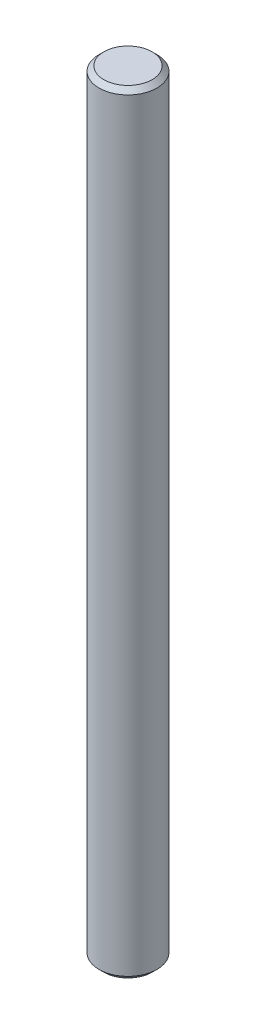
ISO-10303-21;
HEADER;
FILE_DESCRIPTION(('STEP AP214'),'2;1');
FILE_NAME('part.step','',(''),(''),'','','');
FILE_SCHEMA(('AUTOMOTIVE_DESIGN { 1 0 10303 214 1 1 1 1 }'));
ENDSEC;
DATA;
#1=APPLICATION_CONTEXT('core data for automotive mechanical design processes');
#2=APPLICATION_PROTOCOL_DEFINITION('international standard','automotive_design',2000,#1);
#3=PRODUCT_CONTEXT('',#1,'mechanical');
#4=PRODUCT('Part','Part','',(#3));
#5=PRODUCT_RELATED_PRODUCT_CATEGORY('part','',(#4));
#6=PRODUCT_DEFINITION_FORMATION('','',#4);
#7=PRODUCT_DEFINITION_CONTEXT('part definition',#1,'design');
#8=PRODUCT_DEFINITION('design','',#6,#7);
#9=PRODUCT_DEFINITION_SHAPE('','',#8);
#10=(LENGTH_UNIT() NAMED_UNIT(*) SI_UNIT(.MILLI.,.METRE.));
#11=(NAMED_UNIT(*) PLANE_ANGLE_UNIT() SI_UNIT($,.RADIAN.));
#12=(NAMED_UNIT(*) SI_UNIT($,.STERADIAN.) SOLID_ANGLE_UNIT());
#13=UNCERTAINTY_MEASURE_WITH_UNIT(LENGTH_MEASURE(1.E-05),#10,'distance_accuracy_value','');
#14=(GEOMETRIC_REPRESENTATION_CONTEXT(3) GLOBAL_UNCERTAINTY_ASSIGNED_CONTEXT((#13)) GLOBAL_UNIT_ASSIGNED_CONTEXT((#10,
#11,#12)) REPRESENTATION_CONTEXT('',''));
#15=CARTESIAN_POINT('',(0.,0.,0.));
#16=DIRECTION('',(0.,0.,1.));
#17=DIRECTION('',(1.,0.,0.));
#18=AXIS2_PLACEMENT_3D('',#15,#16,#17);
#19=CARTESIAN_POINT('',(0.,40.,0.));
#20=DIRECTION('',(0.,-1.,0.));
#21=DIRECTION('',(0.,0.,-1.));
#22=AXIS2_PLACEMENT_3D('',#19,#20,#21);
#23=CYLINDRICAL_SURFACE('',#22,1.5);
#24=CARTESIAN_POINT('',(0.,0.249999999999993,0.));
#25=DIRECTION('',(0.,1.,0.));
#26=DIRECTION('',(0.,0.,1.));
#27=AXIS2_PLACEMENT_3D('',#24,#25,#26);
#28=CIRCLE('',#27,1.5);
#29=CARTESIAN_POINT('',(0.,0.249999999999993,1.5));
#30=VERTEX_POINT('',#29);
#31=EDGE_CURVE('E53',#30,#30,#28,.T.);
#32=ORIENTED_EDGE('',*,*,#31,.T.);
#33=EDGE_LOOP('',(#32));
#34=FACE_BOUND('',#33,.T.);
#35=CARTESIAN_POINT('',(0.,39.75,0.));
#36=DIRECTION('',(0.,1.,0.));
#37=DIRECTION('',(0.,0.,1.));
#38=AXIS2_PLACEMENT_3D('',#35,#36,#37);
#39=CIRCLE('',#38,1.5);
#40=CARTESIAN_POINT('',(0.,39.75,1.5));
#41=VERTEX_POINT('',#40);
#42=EDGE_CURVE('E58',#41,#41,#39,.F.);
#43=ORIENTED_EDGE('',*,*,#42,.T.);
#44=EDGE_LOOP('',(#43));
#45=FACE_BOUND('',#44,.T.);
#46=ADVANCED_FACE('F39',(#34,#45),#23,.T.);
#47=CARTESIAN_POINT('',(0.,40.,0.));
#48=DIRECTION('',(0.,1.,0.));
#49=DIRECTION('',(0.,0.,1.));
#50=AXIS2_PLACEMENT_3D('',#47,#48,#49);
#51=PLANE('',#50);
#52=CARTESIAN_POINT('',(0.,40.,0.));
#53=DIRECTION('',(0.,1.,0.));
#54=DIRECTION('',(0.,0.,1.));
#55=AXIS2_PLACEMENT_3D('',#52,#53,#54);
#56=CIRCLE('',#55,1.25);
#57=CARTESIAN_POINT('',(0.,40.,1.25));
#58=VERTEX_POINT('',#57);
#59=EDGE_CURVE('E10',#58,#58,#56,.T.);
#60=ORIENTED_EDGE('',*,*,#59,.T.);
#61=EDGE_LOOP('',(#60));
#62=FACE_BOUND('',#61,.T.);
#63=ADVANCED_FACE('F75',(#62),#51,.T.);
#64=CARTESIAN_POINT('',(0.,0.,0.));
#65=DIRECTION('',(0.,1.,0.));
#66=DIRECTION('',(0.,0.,1.));
#67=AXIS2_PLACEMENT_3D('',#64,#65,#66);
#68=PLANE('',#67);
#69=CARTESIAN_POINT('',(0.,0.,0.));
#70=DIRECTION('',(0.,1.,0.));
#71=DIRECTION('',(0.,0.,1.));
#72=AXIS2_PLACEMENT_3D('',#69,#70,#71);
#73=CIRCLE('',#72,1.25000000000001);
#74=CARTESIAN_POINT('',(0.,0.,1.25000000000001));
#75=VERTEX_POINT('',#74);
#76=EDGE_CURVE('E48',#75,#75,#73,.F.);
#77=ORIENTED_EDGE('',*,*,#76,.T.);
#78=EDGE_LOOP('',(#77));
#79=FACE_BOUND('',#78,.T.);
#80=ADVANCED_FACE('F72',(#79),#68,.F.);
#81=CARTESIAN_POINT('',(0.,0.249999999999993,0.));
#82=DIRECTION('',(0.,1.,0.));
#83=DIRECTION('',(0.,0.,1.));
#84=AXIS2_PLACEMENT_3D('',#81,#82,#83);
#85=CONICAL_SURFACE('',#84,1.5,0.785398163397445);
#86=ORIENTED_EDGE('',*,*,#76,.F.);
#87=EDGE_LOOP('',(#86));
#88=FACE_BOUND('',#87,.T.);
#89=ORIENTED_EDGE('',*,*,#31,.F.);
#90=EDGE_LOOP('',(#89));
#91=FACE_BOUND('',#90,.T.);
#92=ADVANCED_FACE('F68',(#88,#91),#85,.T.);
#93=CARTESIAN_POINT('',(0.,40.,0.));
#94=DIRECTION('',(0.,-1.,0.));
#95=DIRECTION('',(0.,0.,-1.));
#96=AXIS2_PLACEMENT_3D('',#93,#94,#95);
#97=CONICAL_SURFACE('',#96,1.25,0.785398163397452);
#98=ORIENTED_EDGE('',*,*,#42,.F.);
#99=EDGE_LOOP('',(#98));
#100=FACE_BOUND('',#99,.T.);
#101=ORIENTED_EDGE('',*,*,#59,.F.);
#102=EDGE_LOOP('',(#101));
#103=FACE_BOUND('',#102,.T.);
#104=ADVANCED_FACE('F42',(#100,#103),#97,.T.);
#105=CLOSED_SHELL('',(#46,#63,#80,#92,#104));
#106=MANIFOLD_SOLID_BREP('B2',#105);
#107=ADVANCED_BREP_SHAPE_REPRESENTATION('',(#18,#106),#14);
#108=SHAPE_DEFINITION_REPRESENTATION(#9,#107);
ENDSEC;
END-ISO-10303-21;
